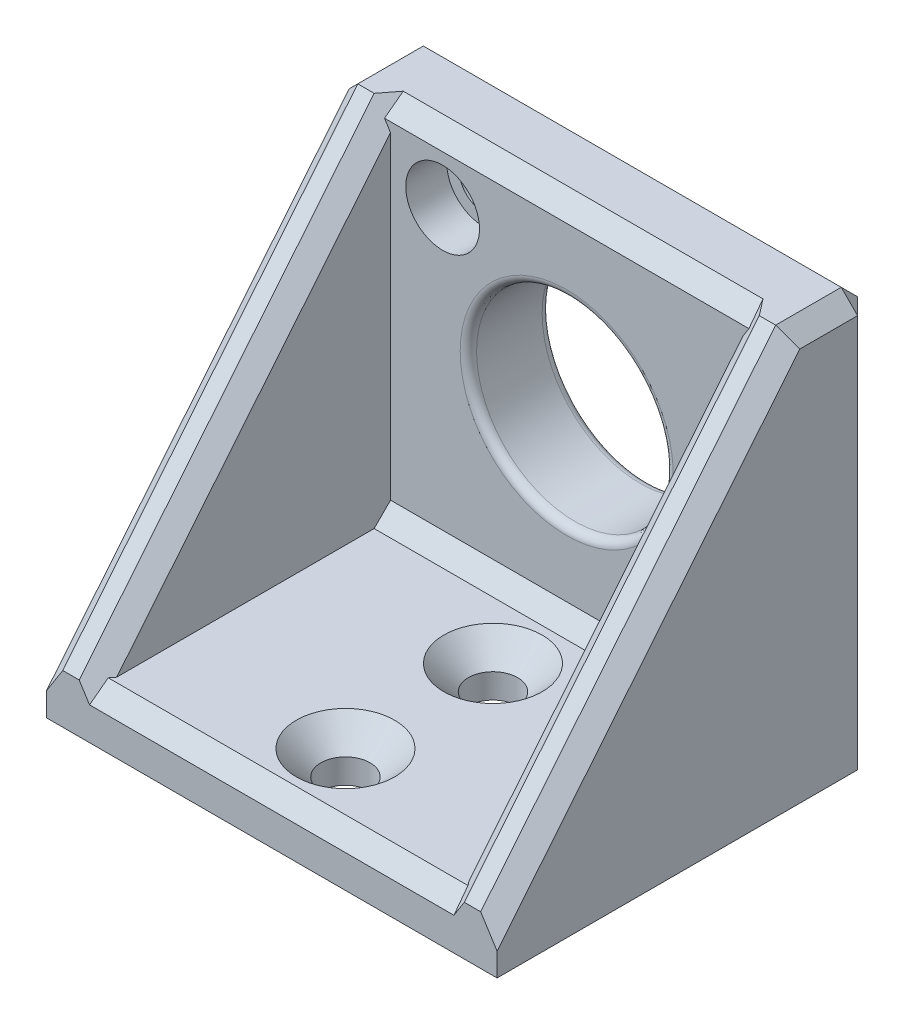
ISO-10303-21;
HEADER;
FILE_DESCRIPTION(('STEP AP214'),'2;1');
FILE_NAME('part.step','',(''),(''),'','','');
FILE_SCHEMA(('AUTOMOTIVE_DESIGN { 1 0 10303 214 1 1 1 1 }'));
ENDSEC;
DATA;
#1=APPLICATION_CONTEXT('core data for automotive mechanical design processes');
#2=APPLICATION_PROTOCOL_DEFINITION('international standard','automotive_design',2000,#1);
#3=PRODUCT_CONTEXT('',#1,'mechanical');
#4=PRODUCT('Part','Part','',(#3));
#5=PRODUCT_RELATED_PRODUCT_CATEGORY('part','',(#4));
#6=PRODUCT_DEFINITION_FORMATION('','',#4);
#7=PRODUCT_DEFINITION_CONTEXT('part definition',#1,'design');
#8=PRODUCT_DEFINITION('design','',#6,#7);
#9=PRODUCT_DEFINITION_SHAPE('','',#8);
#10=(LENGTH_UNIT() NAMED_UNIT(*) SI_UNIT(.MILLI.,.METRE.));
#11=(NAMED_UNIT(*) PLANE_ANGLE_UNIT() SI_UNIT($,.RADIAN.));
#12=(NAMED_UNIT(*) SI_UNIT($,.STERADIAN.) SOLID_ANGLE_UNIT());
#13=UNCERTAINTY_MEASURE_WITH_UNIT(LENGTH_MEASURE(1.E-05),#10,'distance_accuracy_value','');
#14=(GEOMETRIC_REPRESENTATION_CONTEXT(3) GLOBAL_UNCERTAINTY_ASSIGNED_CONTEXT((#13)) GLOBAL_UNIT_ASSIGNED_CONTEXT((#10,
#11,#12)) REPRESENTATION_CONTEXT('',''));
#15=CARTESIAN_POINT('',(0.,0.,0.));
#16=DIRECTION('',(0.,0.,1.));
#17=DIRECTION('',(1.,0.,0.));
#18=AXIS2_PLACEMENT_3D('',#15,#16,#17);
#19=CARTESIAN_POINT('',(-7.57152999600558,8.54331700444714,0.));
#20=DIRECTION('',(0.,0.,1.));
#21=DIRECTION('',(1.,0.,0.));
#22=AXIS2_PLACEMENT_3D('',#19,#20,#21);
#23=CYLINDRICAL_SURFACE('',#22,1.5);
#24=CARTESIAN_POINT('',(-7.57152999600558,8.54331700444714,0.));
#25=DIRECTION('',(0.,0.,1.));
#26=DIRECTION('',(1.,0.,0.));
#27=AXIS2_PLACEMENT_3D('',#24,#25,#26);
#28=CIRCLE('',#27,1.5);
#29=CARTESIAN_POINT('',(-6.07152999600558,8.54331700444714,0.));
#30=VERTEX_POINT('',#29);
#31=EDGE_CURVE('E277',#30,#30,#28,.T.);
#32=ORIENTED_EDGE('',*,*,#31,.F.);
#33=EDGE_LOOP('',(#32));
#34=FACE_BOUND('',#33,.T.);
#35=CARTESIAN_POINT('',(-7.57152999600558,8.54331700444714,2.5));
#36=DIRECTION('',(0.,0.,1.));
#37=DIRECTION('',(1.,0.,0.));
#38=AXIS2_PLACEMENT_3D('',#35,#36,#37);
#39=CIRCLE('',#38,1.5);
#40=CARTESIAN_POINT('',(-6.07152999600558,8.54331700444714,2.5));
#41=VERTEX_POINT('',#40);
#42=EDGE_CURVE('E49',#41,#41,#39,.F.);
#43=ORIENTED_EDGE('',*,*,#42,.F.);
#44=EDGE_LOOP('',(#43));
#45=FACE_BOUND('',#44,.T.);
#46=ADVANCED_FACE('F45',(#34,#45),#23,.F.);
#47=CARTESIAN_POINT('',(0.,0.,5.));
#48=DIRECTION('',(0.,0.,-1.));
#49=DIRECTION('',(-1.,0.,0.));
#50=AXIS2_PLACEMENT_3D('',#47,#48,#49);
#51=PLANE('',#50);
#52=CARTESIAN_POINT('',(-7.57152999600558,8.54331700444714,5.));
#53=DIRECTION('',(0.,0.,1.));
#54=DIRECTION('',(1.,0.,0.));
#55=AXIS2_PLACEMENT_3D('',#52,#53,#54);
#56=CIRCLE('',#55,2.25);
#57=CARTESIAN_POINT('',(-5.32152999600558,8.54331700444714,5.));
#58=VERTEX_POINT('',#57);
#59=EDGE_CURVE('E980',#58,#58,#56,.T.);
#60=ORIENTED_EDGE('',*,*,#59,.F.);
#61=EDGE_LOOP('',(#60));
#62=FACE_BOUND('',#61,.T.);
#63=CARTESIAN_POINT('',(0.,1.5,5.));
#64=DIRECTION('',(0.,0.,-1.));
#65=DIRECTION('',(-1.,0.,0.));
#66=AXIS2_PLACEMENT_3D('',#63,#64,#65);
#67=CIRCLE('',#66,6.5);
#68=CARTESIAN_POINT('',(-6.5,1.5,5.));
#69=VERTEX_POINT('',#68);
#70=EDGE_CURVE('E54',#69,#69,#67,.T.);
#71=ORIENTED_EDGE('',*,*,#70,.T.);
#72=EDGE_LOOP('',(#71));
#73=FACE_BOUND('',#72,.T.);
#74=DIRECTION('',(0.,-1.,0.));
#75=VECTOR('',#74,1.);
#76=CARTESIAN_POINT('',(-10.75,12.5,5.));
#77=LINE('',#76,#75);
#78=CARTESIAN_POINT('',(-10.75,10.9208143996053,5.));
#79=VERTEX_POINT('',#78);
#80=CARTESIAN_POINT('',(-10.75,-8.50000000000001,5.));
#81=VERTEX_POINT('',#80);
#82=EDGE_CURVE('E449',#79,#81,#77,.T.);
#83=ORIENTED_EDGE('',*,*,#82,.T.);
#84=DIRECTION('',(1.,0.,0.));
#85=VECTOR('',#84,1.);
#86=CARTESIAN_POINT('',(10.75,-8.50000000000001,5.));
#87=LINE('',#86,#85);
#88=CARTESIAN_POINT('',(10.75,-8.50000000000001,5.));
#89=VERTEX_POINT('',#88);
#90=EDGE_CURVE('E330',#81,#89,#87,.T.);
#91=ORIENTED_EDGE('',*,*,#90,.T.);
#92=DIRECTION('',(0.,1.,0.));
#93=VECTOR('',#92,1.);
#94=CARTESIAN_POINT('',(10.75,-9.50000000000001,5.));
#95=LINE('',#94,#93);
#96=CARTESIAN_POINT('',(10.75,10.9208143996053,5.));
#97=VERTEX_POINT('',#96);
#98=EDGE_CURVE('E461',#89,#97,#95,.T.);
#99=ORIENTED_EDGE('',*,*,#98,.T.);
#100=DIRECTION('',(-0.534994468449987,-0.844855560867013,0.));
#101=VECTOR('',#100,1.);
#102=CARTESIAN_POINT('',(2.73701264876472,-1.73317984160995,5.));
#103=LINE('',#102,#101);
#104=CARTESIAN_POINT('',(11.1167622097427,11.5,5.));
#105=VERTEX_POINT('',#104);
#106=EDGE_CURVE('E312',#97,#105,#103,.F.);
#107=ORIENTED_EDGE('',*,*,#106,.T.);
#108=DIRECTION('',(-1.,0.,0.));
#109=VECTOR('',#108,1.);
#110=CARTESIAN_POINT('',(0.,11.5,5.));
#111=LINE('',#110,#109);
#112=CARTESIAN_POINT('',(-11.1167622097428,11.5,5.));
#113=VERTEX_POINT('',#112);
#114=EDGE_CURVE('E327',#105,#113,#111,.T.);
#115=ORIENTED_EDGE('',*,*,#114,.T.);
#116=DIRECTION('',(-0.534994468449987,0.844855560867013,0.));
#117=VECTOR('',#116,1.);
#118=CARTESIAN_POINT('',(-2.73701264876472,-1.73317984160995,5.));
#119=LINE('',#118,#117);
#120=EDGE_CURVE('E315',#113,#79,#119,.F.);
#121=ORIENTED_EDGE('',*,*,#120,.T.);
#122=EDGE_LOOP('',(#83,#91,#99,#107,#115,#121));
#123=FACE_BOUND('',#122,.T.);
#124=ADVANCED_FACE('F362',(#62,#73,#123),#51,.F.);
#125=CARTESIAN_POINT('',(-13.75,12.5,5.));
#126=DIRECTION('',(1.,0.,0.));
#127=DIRECTION('',(0.,1.,0.));
#128=AXIS2_PLACEMENT_3D('',#125,#126,#127);
#129=PLANE('',#128);
#130=DIRECTION('',(0.,-1.,0.));
#131=VECTOR('',#130,1.);
#132=CARTESIAN_POINT('',(-13.75,-12.5,23.));
#133=LINE('',#132,#131);
#134=CARTESIAN_POINT('',(-13.75,-11.0791856003947,23.));
#135=VERTEX_POINT('',#134);
#136=CARTESIAN_POINT('',(-13.75,-12.5,23.));
#137=VERTEX_POINT('',#136);
#138=EDGE_CURVE('E185',#135,#137,#133,.T.);
#139=ORIENTED_EDGE('',*,*,#138,.F.);
#140=DIRECTION('',(0.,0.773957299203321,-0.633237790257263));
#141=VECTOR('',#140,1.);
#142=CARTESIAN_POINT('',(-13.75,11.8667622097427,4.22604270079668));
#143=LINE('',#142,#141);
#144=CARTESIAN_POINT('',(-13.75,11.5,4.52612087240438));
#145=VERTEX_POINT('',#144);
#146=EDGE_CURVE('E240',#135,#145,#143,.T.);
#147=ORIENTED_EDGE('',*,*,#146,.T.);
#148=DIRECTION('',(0.,0.,-1.));
#149=VECTOR('',#148,1.);
#150=CARTESIAN_POINT('',(-13.75,11.5,5.));
#151=LINE('',#150,#149);
#152=CARTESIAN_POINT('',(-13.75,11.5,0.999999999999997));
#153=VERTEX_POINT('',#152);
#154=EDGE_CURVE('E238',#145,#153,#151,.T.);
#155=ORIENTED_EDGE('',*,*,#154,.T.);
#156=DIRECTION('',(0.,-1.,0.));
#157=VECTOR('',#156,1.);
#158=CARTESIAN_POINT('',(-13.75,-12.5,0.999999999999997));
#159=LINE('',#158,#157);
#160=CARTESIAN_POINT('',(-13.75,-12.5,0.999999999999997));
#161=VERTEX_POINT('',#160);
#162=EDGE_CURVE('E204',#153,#161,#159,.T.);
#163=ORIENTED_EDGE('',*,*,#162,.T.);
#164=DIRECTION('',(0.,0.,-1.));
#165=VECTOR('',#164,1.);
#166=CARTESIAN_POINT('',(-13.75,-12.5,5.));
#167=LINE('',#166,#165);
#168=EDGE_CURVE('E201',#137,#161,#167,.T.);
#169=ORIENTED_EDGE('',*,*,#168,.F.);
#170=EDGE_LOOP('',(#139,#147,#155,#163,#169));
#171=FACE_BOUND('',#170,.T.);
#172=ADVANCED_FACE('F202',(#171),#129,.F.);
#173=CARTESIAN_POINT('',(13.75,-12.5,5.));
#174=DIRECTION('',(0.,1.,0.));
#175=DIRECTION('',(-1.,0.,0.));
#176=AXIS2_PLACEMENT_3D('',#173,#174,#175);
#177=PLANE('',#176);
#178=CARTESIAN_POINT('',(0.,-12.5,9.5));
#179=DIRECTION('',(0.,1.,0.));
#180=DIRECTION('',(-1.,0.,0.));
#181=AXIS2_PLACEMENT_3D('',#178,#179,#180);
#182=CIRCLE('',#181,1.5);
#183=CARTESIAN_POINT('',(-1.5,-12.5,9.5));
#184=VERTEX_POINT('',#183);
#185=EDGE_CURVE('E451',#184,#184,#182,.T.);
#186=ORIENTED_EDGE('',*,*,#185,.T.);
#187=EDGE_LOOP('',(#186));
#188=FACE_BOUND('',#187,.T.);
#189=CARTESIAN_POINT('',(0.,-12.5,18.5));
#190=DIRECTION('',(0.,1.,0.));
#191=DIRECTION('',(-1.,0.,0.));
#192=AXIS2_PLACEMENT_3D('',#189,#190,#191);
#193=CIRCLE('',#192,1.5);
#194=CARTESIAN_POINT('',(-1.5,-12.5,18.5));
#195=VERTEX_POINT('',#194);
#196=EDGE_CURVE('E298',#195,#195,#193,.T.);
#197=ORIENTED_EDGE('',*,*,#196,.T.);
#198=EDGE_LOOP('',(#197));
#199=FACE_BOUND('',#198,.T.);
#200=ORIENTED_EDGE('',*,*,#168,.T.);
#201=DIRECTION('',(0.70710678118655,0.,-0.707106781186545));
#202=VECTOR('',#201,1.);
#203=CARTESIAN_POINT('',(-13.75,-12.5,0.999999999999998));
#204=LINE('',#203,#202);
#205=CARTESIAN_POINT('',(-12.75,-12.5,0.));
#206=VERTEX_POINT('',#205);
#207=EDGE_CURVE('E265',#161,#206,#204,.T.);
#208=ORIENTED_EDGE('',*,*,#207,.T.);
#209=DIRECTION('',(1.,0.,0.));
#210=VECTOR('',#209,1.);
#211=CARTESIAN_POINT('',(13.75,-12.5,0.));
#212=LINE('',#211,#210);
#213=CARTESIAN_POINT('',(12.75,-12.5,0.));
#214=VERTEX_POINT('',#213);
#215=EDGE_CURVE('E219',#206,#214,#212,.T.);
#216=ORIENTED_EDGE('',*,*,#215,.T.);
#217=DIRECTION('',(0.70710678118655,0.,0.707106781186545));
#218=VECTOR('',#217,1.);
#219=CARTESIAN_POINT('',(13.75,-12.5,0.999999999999997));
#220=LINE('',#219,#218);
#221=CARTESIAN_POINT('',(13.75,-12.5,0.999999999999997));
#222=VERTEX_POINT('',#221);
#223=EDGE_CURVE('E263',#214,#222,#220,.T.);
#224=ORIENTED_EDGE('',*,*,#223,.T.);
#225=DIRECTION('',(0.,0.,-1.));
#226=VECTOR('',#225,1.);
#227=CARTESIAN_POINT('',(13.75,-12.5,5.));
#228=LINE('',#227,#226);
#229=CARTESIAN_POINT('',(13.75,-12.5,23.));
#230=VERTEX_POINT('',#229);
#231=EDGE_CURVE('E208',#230,#222,#228,.T.);
#232=ORIENTED_EDGE('',*,*,#231,.F.);
#233=DIRECTION('',(1.,0.,0.));
#234=VECTOR('',#233,1.);
#235=CARTESIAN_POINT('',(-13.75,-12.5,23.));
#236=LINE('',#235,#234);
#237=EDGE_CURVE('E191',#137,#230,#236,.T.);
#238=ORIENTED_EDGE('',*,*,#237,.F.);
#239=EDGE_LOOP('',(#200,#208,#216,#224,#232,#238));
#240=FACE_BOUND('',#239,.T.);
#241=ADVANCED_FACE('F210',(#188,#199,#240),#177,.F.);
#242=CARTESIAN_POINT('',(13.75,12.5,5.));
#243=DIRECTION('',(-1.,0.,0.));
#244=DIRECTION('',(0.,-1.,0.));
#245=AXIS2_PLACEMENT_3D('',#242,#243,#244);
#246=PLANE('',#245);
#247=DIRECTION('',(0.,0.,1.));
#248=VECTOR('',#247,1.);
#249=CARTESIAN_POINT('',(13.75,11.5,5.));
#250=LINE('',#249,#248);
#251=CARTESIAN_POINT('',(13.75,11.5,0.999999999999997));
#252=VERTEX_POINT('',#251);
#253=CARTESIAN_POINT('',(13.75,11.5,4.52612087240438));
#254=VERTEX_POINT('',#253);
#255=EDGE_CURVE('E250',#252,#254,#250,.T.);
#256=ORIENTED_EDGE('',*,*,#255,.T.);
#257=DIRECTION('',(0.,-0.773957299203321,0.633237790257263));
#258=VECTOR('',#257,1.);
#259=CARTESIAN_POINT('',(13.75,-10.1332377902573,22.2260427007967));
#260=LINE('',#259,#258);
#261=CARTESIAN_POINT('',(13.75,-11.0791856003947,23.));
#262=VERTEX_POINT('',#261);
#263=EDGE_CURVE('E252',#254,#262,#260,.T.);
#264=ORIENTED_EDGE('',*,*,#263,.T.);
#265=DIRECTION('',(0.,1.,0.));
#266=VECTOR('',#265,1.);
#267=CARTESIAN_POINT('',(13.75,-12.5,23.));
#268=LINE('',#267,#266);
#269=EDGE_CURVE('E212',#230,#262,#268,.T.);
#270=ORIENTED_EDGE('',*,*,#269,.F.);
#271=ORIENTED_EDGE('',*,*,#231,.T.);
#272=DIRECTION('',(0.,1.,0.));
#273=VECTOR('',#272,1.);
#274=CARTESIAN_POINT('',(13.75,12.5,0.999999999999997));
#275=LINE('',#274,#273);
#276=EDGE_CURVE('E248',#222,#252,#275,.T.);
#277=ORIENTED_EDGE('',*,*,#276,.T.);
#278=EDGE_LOOP('',(#256,#264,#270,#271,#277));
#279=FACE_BOUND('',#278,.T.);
#280=ADVANCED_FACE('F422',(#279),#246,.F.);
#281=CARTESIAN_POINT('',(13.75,12.5,5.));
#282=DIRECTION('',(0.,-1.,0.));
#283=DIRECTION('',(1.,0.,0.));
#284=AXIS2_PLACEMENT_3D('',#281,#282,#283);
#285=PLANE('',#284);
#286=DIRECTION('',(-1.,0.,0.));
#287=VECTOR('',#286,1.);
#288=CARTESIAN_POINT('',(-10.75,12.5,5.));
#289=LINE('',#288,#287);
#290=CARTESIAN_POINT('',(-11.75,12.5,5.));
#291=VERTEX_POINT('',#290);
#292=CARTESIAN_POINT('',(-12.75,12.5,5.));
#293=VERTEX_POINT('',#292);
#294=EDGE_CURVE('E453',#291,#293,#289,.T.);
#295=ORIENTED_EDGE('',*,*,#294,.F.);
#296=DIRECTION('',(-0.612056372482123,0.,0.790814135498364));
#297=VECTOR('',#296,1.);
#298=CARTESIAN_POINT('',(-20.4624109594529,12.5,16.2569659442725));
#299=LINE('',#298,#297);
#300=CARTESIAN_POINT('',(-10.9760427007967,12.5,4.));
#301=VERTEX_POINT('',#300);
#302=EDGE_CURVE('E69',#291,#301,#299,.F.);
#303=ORIENTED_EDGE('',*,*,#302,.T.);
#304=DIRECTION('',(1.,0.,0.));
#305=VECTOR('',#304,1.);
#306=CARTESIAN_POINT('',(13.75,12.5,4.));
#307=LINE('',#306,#305);
#308=CARTESIAN_POINT('',(10.9760427007967,12.5,4.));
#309=VERTEX_POINT('',#308);
#310=EDGE_CURVE('E336',#301,#309,#307,.T.);
#311=ORIENTED_EDGE('',*,*,#310,.T.);
#312=DIRECTION('',(-0.612056372482123,0.,-0.790814135498364));
#313=VECTOR('',#312,1.);
#314=CARTESIAN_POINT('',(11.75,12.5,5.));
#315=LINE('',#314,#313);
#316=CARTESIAN_POINT('',(11.75,12.5,5.));
#317=VERTEX_POINT('',#316);
#318=EDGE_CURVE('E334',#309,#317,#315,.F.);
#319=ORIENTED_EDGE('',*,*,#318,.T.);
#320=DIRECTION('',(-1.,0.,0.));
#321=VECTOR('',#320,1.);
#322=CARTESIAN_POINT('',(13.75,12.5,5.));
#323=LINE('',#322,#321);
#324=CARTESIAN_POINT('',(12.75,12.5,5.));
#325=VERTEX_POINT('',#324);
#326=EDGE_CURVE('E220',#325,#317,#323,.T.);
#327=ORIENTED_EDGE('',*,*,#326,.F.);
#328=DIRECTION('',(0.,0.,-1.));
#329=VECTOR('',#328,1.);
#330=CARTESIAN_POINT('',(12.75,12.5,5.));
#331=LINE('',#330,#329);
#332=CARTESIAN_POINT('',(12.75,12.5,0.999999999999997));
#333=VERTEX_POINT('',#332);
#334=EDGE_CURVE('E258',#325,#333,#331,.T.);
#335=ORIENTED_EDGE('',*,*,#334,.T.);
#336=DIRECTION('',(-1.,0.,0.));
#337=VECTOR('',#336,1.);
#338=CARTESIAN_POINT('',(-13.75,12.5,0.999999999999997));
#339=LINE('',#338,#337);
#340=CARTESIAN_POINT('',(-12.75,12.5,0.999999999999997));
#341=VERTEX_POINT('',#340);
#342=EDGE_CURVE('E256',#333,#341,#339,.T.);
#343=ORIENTED_EDGE('',*,*,#342,.T.);
#344=DIRECTION('',(0.,0.,1.));
#345=VECTOR('',#344,1.);
#346=CARTESIAN_POINT('',(-12.75,12.5,5.));
#347=LINE('',#346,#345);
#348=EDGE_CURVE('E260',#341,#293,#347,.T.);
#349=ORIENTED_EDGE('',*,*,#348,.T.);
#350=EDGE_LOOP('',(#295,#303,#311,#319,#327,#335,#343,#349));
#351=FACE_BOUND('',#350,.T.);
#352=ADVANCED_FACE('F386',(#351),#285,.F.);
#353=CARTESIAN_POINT('',(0.,0.,0.));
#354=DIRECTION('',(0.,0.,-1.));
#355=DIRECTION('',(-1.,0.,0.));
#356=AXIS2_PLACEMENT_3D('',#353,#354,#355);
#357=PLANE('',#356);
#358=CARTESIAN_POINT('',(0.,1.5,0.));
#359=DIRECTION('',(0.,0.,-1.));
#360=DIRECTION('',(-1.,0.,0.));
#361=AXIS2_PLACEMENT_3D('',#358,#359,#360);
#362=CIRCLE('',#361,6.5);
#363=CARTESIAN_POINT('',(-6.5,1.5,0.));
#364=VERTEX_POINT('',#363);
#365=EDGE_CURVE('E11',#364,#364,#362,.F.);
#366=ORIENTED_EDGE('',*,*,#365,.T.);
#367=EDGE_LOOP('',(#366));
#368=FACE_BOUND('',#367,.T.);
#369=ORIENTED_EDGE('',*,*,#31,.T.);
#370=EDGE_LOOP('',(#369));
#371=FACE_BOUND('',#370,.T.);
#372=ORIENTED_EDGE('',*,*,#215,.F.);
#373=DIRECTION('',(0.,1.,0.));
#374=VECTOR('',#373,1.);
#375=CARTESIAN_POINT('',(-12.75,12.5,0.));
#376=LINE('',#375,#374);
#377=CARTESIAN_POINT('',(-12.75,11.5,0.));
#378=VERTEX_POINT('',#377);
#379=EDGE_CURVE('E271',#206,#378,#376,.T.);
#380=ORIENTED_EDGE('',*,*,#379,.T.);
#381=DIRECTION('',(1.,0.,0.));
#382=VECTOR('',#381,1.);
#383=CARTESIAN_POINT('',(13.75,11.5,0.));
#384=LINE('',#383,#382);
#385=CARTESIAN_POINT('',(12.75,11.5,0.));
#386=VERTEX_POINT('',#385);
#387=EDGE_CURVE('E267',#378,#386,#384,.T.);
#388=ORIENTED_EDGE('',*,*,#387,.T.);
#389=DIRECTION('',(0.,-1.,0.));
#390=VECTOR('',#389,1.);
#391=CARTESIAN_POINT('',(12.75,-12.5,0.));
#392=LINE('',#391,#390);
#393=EDGE_CURVE('E269',#386,#214,#392,.T.);
#394=ORIENTED_EDGE('',*,*,#393,.T.);
#395=EDGE_LOOP('',(#372,#380,#388,#394));
#396=FACE_BOUND('',#395,.T.);
#397=ADVANCED_FACE('F382',(#368,#371,#396),#357,.T.);
#398=CARTESIAN_POINT('',(-13.75,-9.50000000000001,23.));
#399=DIRECTION('',(0.,-1.,0.));
#400=DIRECTION('',(0.,0.,-1.));
#401=AXIS2_PLACEMENT_3D('',#398,#399,#400);
#402=PLANE('',#401);
#403=CARTESIAN_POINT('',(0.,-9.50000000000001,18.5));
#404=DIRECTION('',(0.,-1.,0.));
#405=DIRECTION('',(0.,0.,-1.));
#406=AXIS2_PLACEMENT_3D('',#403,#404,#405);
#407=CIRCLE('',#406,3.);
#408=CARTESIAN_POINT('',(0.,-9.5,21.5));
#409=VERTEX_POINT('',#408);
#410=EDGE_CURVE('E231',#409,#409,#407,.T.);
#411=ORIENTED_EDGE('',*,*,#410,.T.);
#412=EDGE_LOOP('',(#411));
#413=FACE_BOUND('',#412,.T.);
#414=CARTESIAN_POINT('',(0.,-9.50000000000001,9.5));
#415=DIRECTION('',(0.,-1.,0.));
#416=DIRECTION('',(0.,0.,-1.));
#417=AXIS2_PLACEMENT_3D('',#414,#415,#416);
#418=CIRCLE('',#417,3.);
#419=CARTESIAN_POINT('',(0.,-9.50000000000001,6.5));
#420=VERTEX_POINT('',#419);
#421=EDGE_CURVE('E228',#420,#420,#418,.T.);
#422=ORIENTED_EDGE('',*,*,#421,.T.);
#423=EDGE_LOOP('',(#422));
#424=FACE_BOUND('',#423,.T.);
#425=DIRECTION('',(0.,0.,-1.));
#426=VECTOR('',#425,1.);
#427=CARTESIAN_POINT('',(10.75,-9.50000000000001,23.));
#428=LINE('',#427,#426);
#429=CARTESIAN_POINT('',(10.75,-9.50000000000001,21.7079390542225));
#430=VERTEX_POINT('',#429);
#431=CARTESIAN_POINT('',(10.75,-9.50000000000001,6.00000000000001));
#432=VERTEX_POINT('',#431);
#433=EDGE_CURVE('E198',#430,#432,#428,.T.);
#434=ORIENTED_EDGE('',*,*,#433,.T.);
#435=DIRECTION('',(-1.,0.,0.));
#436=VECTOR('',#435,1.);
#437=CARTESIAN_POINT('',(-10.75,-9.50000000000001,6.00000000000001));
#438=LINE('',#437,#436);
#439=CARTESIAN_POINT('',(-10.75,-9.50000000000001,6.00000000000001));
#440=VERTEX_POINT('',#439);
#441=EDGE_CURVE('E322',#432,#440,#438,.T.);
#442=ORIENTED_EDGE('',*,*,#441,.T.);
#443=DIRECTION('',(0.,0.,1.));
#444=VECTOR('',#443,1.);
#445=CARTESIAN_POINT('',(-10.75,-9.50000000000001,5.));
#446=LINE('',#445,#444);
#447=CARTESIAN_POINT('',(-10.75,-9.50000000000001,21.7079390542226));
#448=VERTEX_POINT('',#447);
#449=EDGE_CURVE('E448',#440,#448,#446,.T.);
#450=ORIENTED_EDGE('',*,*,#449,.T.);
#451=DIRECTION('',(0.612056372482123,0.,-0.790814135498364));
#452=VECTOR('',#451,1.);
#453=CARTESIAN_POINT('',(-12.499226006192,-9.50000000000001,23.9680456621614));
#454=LINE('',#453,#452);
#455=CARTESIAN_POINT('',(-10.9760427007967,-9.50000000000001,22.));
#456=VERTEX_POINT('',#455);
#457=EDGE_CURVE('E317',#448,#456,#454,.F.);
#458=ORIENTED_EDGE('',*,*,#457,.T.);
#459=DIRECTION('',(1.,0.,0.));
#460=VECTOR('',#459,1.);
#461=CARTESIAN_POINT('',(-13.75,-9.50000000000001,22.));
#462=LINE('',#461,#460);
#463=CARTESIAN_POINT('',(10.9760427007967,-9.50000000000001,22.));
#464=VERTEX_POINT('',#463);
#465=EDGE_CURVE('E320',#456,#464,#462,.T.);
#466=ORIENTED_EDGE('',*,*,#465,.T.);
#467=DIRECTION('',(0.612056372482123,0.,0.790814135498364));
#468=VECTOR('',#467,1.);
#469=CARTESIAN_POINT('',(2.19736842105265,-9.50000000000001,10.6574178074418));
#470=LINE('',#469,#468);
#471=EDGE_CURVE('E310',#464,#430,#470,.F.);
#472=ORIENTED_EDGE('',*,*,#471,.T.);
#473=EDGE_LOOP('',(#434,#442,#450,#458,#466,#472));
#474=FACE_BOUND('',#473,.T.);
#475=ADVANCED_FACE('F385',(#413,#424,#474),#402,.F.);
#476=CARTESIAN_POINT('',(0.,0.,23.));
#477=DIRECTION('',(0.,0.,-1.));
#478=DIRECTION('',(-1.,0.,0.));
#479=AXIS2_PLACEMENT_3D('',#476,#477,#478);
#480=PLANE('',#479);
#481=DIRECTION('',(-1.,0.,0.));
#482=VECTOR('',#481,1.);
#483=CARTESIAN_POINT('',(0.,-10.5,23.));
#484=LINE('',#483,#482);
#485=CARTESIAN_POINT('',(11.1167622097428,-10.5,23.));
#486=VERTEX_POINT('',#485);
#487=CARTESIAN_POINT('',(-11.1167622097427,-10.5,23.));
#488=VERTEX_POINT('',#487);
#489=EDGE_CURVE('E341',#486,#488,#484,.T.);
#490=ORIENTED_EDGE('',*,*,#489,.T.);
#491=DIRECTION('',(0.534994468449987,-0.844855560867013,0.));
#492=VECTOR('',#491,1.);
#493=CARTESIAN_POINT('',(-11.75,-9.50000000000001,23.));
#494=LINE('',#493,#492);
#495=CARTESIAN_POINT('',(-11.75,-9.50000000000001,23.));
#496=VERTEX_POINT('',#495);
#497=EDGE_CURVE('E343',#488,#496,#494,.F.);
#498=ORIENTED_EDGE('',*,*,#497,.T.);
#499=DIRECTION('',(-1.,0.,0.));
#500=VECTOR('',#499,1.);
#501=CARTESIAN_POINT('',(-10.75,-9.50000000000001,23.));
#502=LINE('',#501,#500);
#503=CARTESIAN_POINT('',(-12.75,-9.50000000000001,23.));
#504=VERTEX_POINT('',#503);
#505=EDGE_CURVE('E459',#496,#504,#502,.T.);
#506=ORIENTED_EDGE('',*,*,#505,.T.);
#507=DIRECTION('',(-0.53499446844999,-0.844855560867012,0.));
#508=VECTOR('',#507,1.);
#509=CARTESIAN_POINT('',(-3.37859102507674,5.29919410860795,23.));
#510=LINE('',#509,#508);
#511=EDGE_CURVE('E194',#504,#135,#510,.T.);
#512=ORIENTED_EDGE('',*,*,#511,.T.);
#513=ORIENTED_EDGE('',*,*,#138,.T.);
#514=ORIENTED_EDGE('',*,*,#237,.T.);
#515=ORIENTED_EDGE('',*,*,#269,.T.);
#516=DIRECTION('',(-0.53499446844999,0.844855560867011,0.));
#517=VECTOR('',#516,1.);
#518=CARTESIAN_POINT('',(3.37859102507673,5.29919410860795,23.));
#519=LINE('',#518,#517);
#520=CARTESIAN_POINT('',(12.75,-9.50000000000001,23.));
#521=VERTEX_POINT('',#520);
#522=EDGE_CURVE('E245',#262,#521,#519,.T.);
#523=ORIENTED_EDGE('',*,*,#522,.T.);
#524=DIRECTION('',(-1.,0.,0.));
#525=VECTOR('',#524,1.);
#526=CARTESIAN_POINT('',(-13.75,-9.50000000000001,23.));
#527=LINE('',#526,#525);
#528=CARTESIAN_POINT('',(11.75,-9.50000000000001,23.));
#529=VERTEX_POINT('',#528);
#530=EDGE_CURVE('E214',#521,#529,#527,.T.);
#531=ORIENTED_EDGE('',*,*,#530,.T.);
#532=DIRECTION('',(0.534994468449987,0.844855560867013,0.));
#533=VECTOR('',#532,1.);
#534=CARTESIAN_POINT('',(21.6938471374674,6.20318021201414,23.));
#535=LINE('',#534,#533);
#536=EDGE_CURVE('E61',#529,#486,#535,.F.);
#537=ORIENTED_EDGE('',*,*,#536,.T.);
#538=EDGE_LOOP('',(#490,#498,#506,#512,#513,#514,#515,#523,#531,#537));
#539=FACE_BOUND('',#538,.T.);
#540=ADVANCED_FACE('F188',(#539),#480,.F.);
#541=CARTESIAN_POINT('',(10.75,12.5,5.));
#542=DIRECTION('',(0.,0.633237790257262,0.773957299203321));
#543=DIRECTION('',(0.,-0.773957299203321,0.633237790257263));
#544=AXIS2_PLACEMENT_3D('',#541,#542,#543);
#545=PLANE('',#544);
#546=ORIENTED_EDGE('',*,*,#326,.T.);
#547=DIRECTION('',(0.,-0.773957299203321,0.633237790257263));
#548=VECTOR('',#547,1.);
#549=CARTESIAN_POINT('',(11.75,12.5,5.));
#550=LINE('',#549,#548);
#551=EDGE_CURVE('E273',#317,#529,#550,.T.);
#552=ORIENTED_EDGE('',*,*,#551,.T.);
#553=ORIENTED_EDGE('',*,*,#530,.F.);
#554=DIRECTION('',(0.,0.773957299203321,-0.633237790257263));
#555=VECTOR('',#554,1.);
#556=CARTESIAN_POINT('',(12.75,12.5,5.));
#557=LINE('',#556,#555);
#558=EDGE_CURVE('E254',#521,#325,#557,.T.);
#559=ORIENTED_EDGE('',*,*,#558,.T.);
#560=EDGE_LOOP('',(#546,#552,#553,#559));
#561=FACE_BOUND('',#560,.T.);
#562=ADVANCED_FACE('F429',(#561),#545,.T.);
#563=CARTESIAN_POINT('',(10.75,0.,0.));
#564=DIRECTION('',(-1.,0.,0.));
#565=DIRECTION('',(0.,-1.,0.));
#566=AXIS2_PLACEMENT_3D('',#563,#564,#565);
#567=PLANE('',#566);
#568=ORIENTED_EDGE('',*,*,#98,.F.);
#569=DIRECTION('',(0.,0.707106781186542,-0.707106781186553));
#570=VECTOR('',#569,1.);
#571=CARTESIAN_POINT('',(10.75,-1.75000000000007,-1.75000000000004));
#572=LINE('',#571,#570);
#573=EDGE_CURVE('E332',#89,#432,#572,.F.);
#574=ORIENTED_EDGE('',*,*,#573,.T.);
#575=ORIENTED_EDGE('',*,*,#433,.F.);
#576=DIRECTION('',(0.,0.773957299203321,-0.633237790257263));
#577=VECTOR('',#576,1.);
#578=CARTESIAN_POINT('',(10.75,6.82963349687144,8.34732982950954));
#579=LINE('',#578,#577);
#580=EDGE_CURVE('E301',#430,#97,#579,.T.);
#581=ORIENTED_EDGE('',*,*,#580,.T.);
#582=EDGE_LOOP('',(#568,#574,#575,#581));
#583=FACE_BOUND('',#582,.T.);
#584=ADVANCED_FACE('F474',(#583),#567,.T.);
#585=CARTESIAN_POINT('',(-10.75,-9.50000000000001,23.));
#586=DIRECTION('',(0.,0.633237790257262,0.773957299203321));
#587=DIRECTION('',(0.,-0.773957299203321,0.633237790257263));
#588=AXIS2_PLACEMENT_3D('',#585,#586,#587);
#589=PLANE('',#588);
#590=ORIENTED_EDGE('',*,*,#505,.F.);
#591=DIRECTION('',(0.,0.773957299203321,-0.633237790257263));
#592=VECTOR('',#591,1.);
#593=CARTESIAN_POINT('',(-11.75,-9.50000000000001,23.));
#594=LINE('',#593,#592);
#595=EDGE_CURVE('E304',#496,#291,#594,.T.);
#596=ORIENTED_EDGE('',*,*,#595,.T.);
#597=ORIENTED_EDGE('',*,*,#294,.T.);
#598=DIRECTION('',(0.,-0.773957299203321,0.633237790257263));
#599=VECTOR('',#598,1.);
#600=CARTESIAN_POINT('',(-12.75,-9.50000000000001,23.));
#601=LINE('',#600,#599);
#602=EDGE_CURVE('E242',#293,#504,#601,.T.);
#603=ORIENTED_EDGE('',*,*,#602,.T.);
#604=EDGE_LOOP('',(#590,#596,#597,#603));
#605=FACE_BOUND('',#604,.T.);
#606=ADVANCED_FACE('F482',(#605),#589,.T.);
#607=CARTESIAN_POINT('',(-10.75,0.,0.));
#608=DIRECTION('',(1.,0.,0.));
#609=DIRECTION('',(0.,1.,0.));
#610=AXIS2_PLACEMENT_3D('',#607,#608,#609);
#611=PLANE('',#610);
#612=ORIENTED_EDGE('',*,*,#449,.F.);
#613=DIRECTION('',(0.,-0.707106781186542,0.707106781186553));
#614=VECTOR('',#613,1.);
#615=CARTESIAN_POINT('',(-10.75,-1.75000000000007,-1.75000000000004));
#616=LINE('',#615,#614);
#617=EDGE_CURVE('E325',#440,#81,#616,.F.);
#618=ORIENTED_EDGE('',*,*,#617,.T.);
#619=ORIENTED_EDGE('',*,*,#82,.F.);
#620=DIRECTION('',(0.,-0.773957299203321,0.633237790257263));
#621=VECTOR('',#620,1.);
#622=CARTESIAN_POINT('',(-10.75,6.82963349687144,8.34732982950955));
#623=LINE('',#622,#621);
#624=EDGE_CURVE('E307',#79,#448,#623,.T.);
#625=ORIENTED_EDGE('',*,*,#624,.T.);
#626=EDGE_LOOP('',(#612,#618,#619,#625));
#627=FACE_BOUND('',#626,.T.);
#628=ADVANCED_FACE('F447',(#627),#611,.T.);
#629=CARTESIAN_POINT('',(0.,-14.5,18.5));
#630=DIRECTION('',(0.,1.,0.));
#631=DIRECTION('',(0.,0.,1.));
#632=AXIS2_PLACEMENT_3D('',#629,#630,#631);
#633=CYLINDRICAL_SURFACE('',#632,1.5);
#634=CARTESIAN_POINT('',(0.,-11.,18.5));
#635=DIRECTION('',(0.,-1.,0.));
#636=DIRECTION('',(0.,0.,-1.));
#637=AXIS2_PLACEMENT_3D('',#634,#635,#636);
#638=CIRCLE('',#637,1.5);
#639=CARTESIAN_POINT('',(0.,-11.,20.));
#640=VERTEX_POINT('',#639);
#641=EDGE_CURVE('E207',#640,#640,#638,.F.);
#642=ORIENTED_EDGE('',*,*,#641,.T.);
#643=EDGE_LOOP('',(#642));
#644=FACE_BOUND('',#643,.T.);
#645=ORIENTED_EDGE('',*,*,#196,.F.);
#646=EDGE_LOOP('',(#645));
#647=FACE_BOUND('',#646,.T.);
#648=ADVANCED_FACE('F514',(#644,#647),#633,.F.);
#649=CARTESIAN_POINT('',(0.,-14.5,9.5));
#650=DIRECTION('',(0.,1.,0.));
#651=DIRECTION('',(0.,0.,1.));
#652=AXIS2_PLACEMENT_3D('',#649,#650,#651);
#653=CYLINDRICAL_SURFACE('',#652,1.5);
#654=CARTESIAN_POINT('',(0.,-11.,9.5));
#655=DIRECTION('',(0.,-1.,0.));
#656=DIRECTION('',(0.,0.,-1.));
#657=AXIS2_PLACEMENT_3D('',#654,#655,#656);
#658=CIRCLE('',#657,1.5);
#659=CARTESIAN_POINT('',(0.,-11.,8.));
#660=VERTEX_POINT('',#659);
#661=EDGE_CURVE('E234',#660,#660,#658,.F.);
#662=ORIENTED_EDGE('',*,*,#661,.T.);
#663=EDGE_LOOP('',(#662));
#664=FACE_BOUND('',#663,.T.);
#665=ORIENTED_EDGE('',*,*,#185,.F.);
#666=EDGE_LOOP('',(#665));
#667=FACE_BOUND('',#666,.T.);
#668=ADVANCED_FACE('F510',(#664,#667),#653,.F.);
#669=CARTESIAN_POINT('',(0.,-11.,18.5));
#670=DIRECTION('',(0.,1.,0.));
#671=DIRECTION('',(0.,0.,1.));
#672=AXIS2_PLACEMENT_3D('',#669,#670,#671);
#673=CONICAL_SURFACE('',#672,1.5,0.785398163397449);
#674=CARTESIAN_POINT('',(0.,-9.5,21.5));
#675=CARTESIAN_POINT('',(0.,-9.515625,21.484375));
#676=CARTESIAN_POINT('',(0.,-9.53125,21.46875));
#677=CARTESIAN_POINT('',(0.,-9.5625,21.4375));
#678=CARTESIAN_POINT('',(0.,-9.578125,21.421875));
#679=CARTESIAN_POINT('',(0.,-9.609375,21.390625));
#680=CARTESIAN_POINT('',(0.,-9.625,21.375));
#681=CARTESIAN_POINT('',(0.,-9.65625,21.34375));
#682=CARTESIAN_POINT('',(0.,-9.671875,21.328125));
#683=CARTESIAN_POINT('',(0.,-9.703125,21.296875));
#684=CARTESIAN_POINT('',(0.,-9.71875,21.28125));
#685=CARTESIAN_POINT('',(0.,-9.75,21.25));
#686=CARTESIAN_POINT('',(0.,-9.765625,21.234375));
#687=CARTESIAN_POINT('',(0.,-9.796875,21.203125));
#688=CARTESIAN_POINT('',(0.,-9.8125,21.1875));
#689=CARTESIAN_POINT('',(0.,-9.84375,21.15625));
#690=CARTESIAN_POINT('',(0.,-9.859375,21.140625));
#691=CARTESIAN_POINT('',(0.,-9.890625,21.109375));
#692=CARTESIAN_POINT('',(0.,-9.90625,21.09375));
#693=CARTESIAN_POINT('',(0.,-9.9375,21.0625));
#694=CARTESIAN_POINT('',(0.,-9.953125,21.046875));
#695=CARTESIAN_POINT('',(0.,-9.984375,21.015625));
#696=CARTESIAN_POINT('',(0.,-10.,21.));
#697=CARTESIAN_POINT('',(0.,-10.03125,20.96875));
#698=CARTESIAN_POINT('',(0.,-10.046875,20.953125));
#699=CARTESIAN_POINT('',(0.,-10.078125,20.921875));
#700=CARTESIAN_POINT('',(0.,-10.09375,20.90625));
#701=CARTESIAN_POINT('',(0.,-10.125,20.875));
#702=CARTESIAN_POINT('',(0.,-10.140625,20.859375));
#703=CARTESIAN_POINT('',(0.,-10.171875,20.828125));
#704=CARTESIAN_POINT('',(0.,-10.1875,20.8125));
#705=CARTESIAN_POINT('',(0.,-10.21875,20.78125));
#706=CARTESIAN_POINT('',(0.,-10.234375,20.765625));
#707=CARTESIAN_POINT('',(0.,-10.265625,20.734375));
#708=CARTESIAN_POINT('',(0.,-10.28125,20.71875));
#709=CARTESIAN_POINT('',(0.,-10.3125,20.6875));
#710=CARTESIAN_POINT('',(0.,-10.328125,20.671875));
#711=CARTESIAN_POINT('',(0.,-10.359375,20.640625));
#712=CARTESIAN_POINT('',(0.,-10.375,20.625));
#713=CARTESIAN_POINT('',(0.,-10.40625,20.59375));
#714=CARTESIAN_POINT('',(0.,-10.421875,20.578125));
#715=CARTESIAN_POINT('',(0.,-10.453125,20.546875));
#716=CARTESIAN_POINT('',(0.,-10.46875,20.53125));
#717=CARTESIAN_POINT('',(0.,-10.5,20.5));
#718=CARTESIAN_POINT('',(0.,-10.515625,20.484375));
#719=CARTESIAN_POINT('',(0.,-10.546875,20.453125));
#720=CARTESIAN_POINT('',(0.,-10.5625,20.4375));
#721=CARTESIAN_POINT('',(0.,-10.59375,20.40625));
#722=CARTESIAN_POINT('',(0.,-10.609375,20.390625));
#723=CARTESIAN_POINT('',(0.,-10.640625,20.359375));
#724=CARTESIAN_POINT('',(0.,-10.65625,20.34375));
#725=CARTESIAN_POINT('',(0.,-10.6875,20.3125));
#726=CARTESIAN_POINT('',(0.,-10.703125,20.296875));
#727=CARTESIAN_POINT('',(0.,-10.734375,20.265625));
#728=CARTESIAN_POINT('',(0.,-10.75,20.25));
#729=CARTESIAN_POINT('',(0.,-10.78125,20.21875));
#730=CARTESIAN_POINT('',(0.,-10.796875,20.203125));
#731=CARTESIAN_POINT('',(0.,-10.828125,20.171875));
#732=CARTESIAN_POINT('',(0.,-10.84375,20.15625));
#733=CARTESIAN_POINT('',(0.,-10.875,20.125));
#734=CARTESIAN_POINT('',(0.,-10.890625,20.109375));
#735=CARTESIAN_POINT('',(0.,-10.921875,20.078125));
#736=CARTESIAN_POINT('',(0.,-10.9375,20.0625));
#737=CARTESIAN_POINT('',(0.,-10.96875,20.03125));
#738=CARTESIAN_POINT('',(0.,-10.984375,20.015625));
#739=CARTESIAN_POINT('',(0.,-11.,20.));
#740=B_SPLINE_CURVE_WITH_KNOTS('',3,(#674,#675,#676,#677,#678,#679,#680,#681,#682,#683,#684,
#685,#686,#687,#688,#689,#690,#691,#692,#693,#694,#695,#696,#697,#698,#699,#700,#701,#702,#703,
#704,#705,#706,#707,#708,#709,#710,#711,#712,#713,#714,#715,#716,#717,#718,#719,#720,#721,#722,
#723,#724,#725,#726,#727,#728,#729,#730,#731,#732,#733,#734,#735,#736,#737,#738,#739),
.UNSPECIFIED.,.F.,.F.,(4,2,2,2,2,2,2,2,2,2,2,2,2,2,2,2,2,2,2,2,2,2,2,2,2,2,2,2,2,2,2,2,4),(0.,
0.0662912607362401,0.132582521472478,0.198873782208718,0.265165042944956,0.331456303681193,
0.397747564417433,0.464038825153673,0.530330085889911,0.596621346626149,0.662912607362388,
0.729203868098628,0.795495128834865,0.861786389571103,0.928077650307343,0.994368911043583,
1.06066017177982,1.12695143251606,1.1932426932523,1.25953395398854,1.32582521472478,
1.39211647546101,1.45840773619725,1.52469899693349,1.59099025766973,1.65728151840597,
1.72357277914221,1.78986403987845,1.85615530061469,1.92244656135092,1.98873782208716,
2.0550290828234,2.12132034355964),.UNSPECIFIED.);
#741=EDGE_CURVE('BSEAM513',#409,#640,#740,.T.);
#742=ORIENTED_EDGE('',*,*,#410,.F.);
#743=ORIENTED_EDGE('',*,*,#641,.F.);
#744=ORIENTED_EDGE('',*,*,#741,.T.);
#745=ORIENTED_EDGE('',*,*,#741,.F.);
#746=EDGE_LOOP('',(#742,#744,#743,#745));
#747=FACE_BOUND('',#746,.T.);
#748=ADVANCED_FACE('F513',(#747),#673,.F.);
#749=CARTESIAN_POINT('',(0.,-11.,9.5));
#750=DIRECTION('',(0.,1.,0.));
#751=DIRECTION('',(0.,0.,1.));
#752=AXIS2_PLACEMENT_3D('',#749,#750,#751);
#753=CONICAL_SURFACE('',#752,1.5,0.78539816339745);
#754=ORIENTED_EDGE('',*,*,#421,.F.);
#755=EDGE_LOOP('',(#754));
#756=FACE_BOUND('',#755,.T.);
#757=ORIENTED_EDGE('',*,*,#661,.F.);
#758=EDGE_LOOP('',(#757));
#759=FACE_BOUND('',#758,.T.);
#760=ADVANCED_FACE('F547',(#756,#759),#753,.F.);
#761=CARTESIAN_POINT('',(13.75,11.8667622097427,4.22604270079668));
#762=DIRECTION('',(0.707106781186545,0.447766735594497,0.547270454615496));
#763=DIRECTION('',(0.,0.773957299203321,-0.633237790257263));
#764=AXIS2_PLACEMENT_3D('',#761,#762,#763);
#765=PLANE('',#764);
#766=ORIENTED_EDGE('',*,*,#522,.F.);
#767=ORIENTED_EDGE('',*,*,#263,.F.);
#768=DIRECTION('',(-0.670467604748961,0.670467604748966,0.317720603619558));
#769=VECTOR('',#768,1.);
#770=CARTESIAN_POINT('',(12.75,12.5,4.99999999999999));
#771=LINE('',#770,#769);
#772=EDGE_CURVE('E295',#325,#254,#771,.F.);
#773=ORIENTED_EDGE('',*,*,#772,.F.);
#774=ORIENTED_EDGE('',*,*,#558,.F.);
#775=EDGE_LOOP('',(#766,#767,#773,#774));
#776=FACE_BOUND('',#775,.T.);
#777=ADVANCED_FACE('F425',(#776),#765,.T.);
#778=CARTESIAN_POINT('',(13.75,12.5,0.999999999999997));
#779=DIRECTION('',(0.707106781186545,0.,-0.70710678118655));
#780=DIRECTION('',(0.,-1.,0.));
#781=AXIS2_PLACEMENT_3D('',#778,#779,#780);
#782=PLANE('',#781);
#783=ORIENTED_EDGE('',*,*,#223,.F.);
#784=ORIENTED_EDGE('',*,*,#393,.F.);
#785=DIRECTION('',(-0.70710678118655,0.,-0.707106781186545));
#786=VECTOR('',#785,1.);
#787=CARTESIAN_POINT('',(13.25,11.5,0.499999999999999));
#788=LINE('',#787,#786);
#789=EDGE_CURVE('E292',#252,#386,#788,.T.);
#790=ORIENTED_EDGE('',*,*,#789,.F.);
#791=ORIENTED_EDGE('',*,*,#276,.F.);
#792=EDGE_LOOP('',(#783,#784,#790,#791));
#793=FACE_BOUND('',#792,.T.);
#794=ADVANCED_FACE('F410',(#793),#782,.T.);
#795=CARTESIAN_POINT('',(12.75,12.5,5.));
#796=DIRECTION('',(-0.70710678118655,-0.707106781186545,0.));
#797=DIRECTION('',(0.,0.,-1.));
#798=AXIS2_PLACEMENT_3D('',#795,#796,#797);
#799=PLANE('',#798);
#800=ORIENTED_EDGE('',*,*,#772,.T.);
#801=ORIENTED_EDGE('',*,*,#255,.F.);
#802=DIRECTION('',(-0.707106781186545,0.70710678118655,0.));
#803=VECTOR('',#802,1.);
#804=CARTESIAN_POINT('',(12.75,12.5,0.999999999999997));
#805=LINE('',#804,#803);
#806=EDGE_CURVE('E289',#333,#252,#805,.F.);
#807=ORIENTED_EDGE('',*,*,#806,.F.);
#808=ORIENTED_EDGE('',*,*,#334,.F.);
#809=EDGE_LOOP('',(#800,#801,#807,#808));
#810=FACE_BOUND('',#809,.T.);
#811=ADVANCED_FACE('F418',(#810),#799,.F.);
#812=CARTESIAN_POINT('',(12.75,12.5,0.999999999999997));
#813=DIRECTION('',(0.577350269189626,0.577350269189622,-0.57735026918963));
#814=DIRECTION('',(-0.70710678118655,0.,-0.707106781186545));
#815=AXIS2_PLACEMENT_3D('',#812,#813,#814);
#816=PLANE('',#815);
#817=ORIENTED_EDGE('',*,*,#806,.T.);
#818=ORIENTED_EDGE('',*,*,#789,.T.);
#819=DIRECTION('',(0.,0.70710678118655,0.707106781186545));
#820=VECTOR('',#819,1.);
#821=CARTESIAN_POINT('',(12.75,12.5,0.999999999999997));
#822=LINE('',#821,#820);
#823=EDGE_CURVE('E286',#333,#386,#822,.F.);
#824=ORIENTED_EDGE('',*,*,#823,.F.);
#825=EDGE_LOOP('',(#817,#818,#824));
#826=FACE_BOUND('',#825,.T.);
#827=ADVANCED_FACE('F413',(#826),#816,.T.);
#828=CARTESIAN_POINT('',(-13.75,12.5,0.999999999999997));
#829=DIRECTION('',(-0.707106781186545,0.,-0.70710678118655));
#830=DIRECTION('',(0.,1.,0.));
#831=AXIS2_PLACEMENT_3D('',#828,#829,#830);
#832=PLANE('',#831);
#833=ORIENTED_EDGE('',*,*,#207,.F.);
#834=ORIENTED_EDGE('',*,*,#162,.F.);
#835=DIRECTION('',(-0.70710678118655,0.,0.707106781186545));
#836=VECTOR('',#835,1.);
#837=CARTESIAN_POINT('',(-13.75,11.5,0.999999999999997));
#838=LINE('',#837,#836);
#839=EDGE_CURVE('E283',#378,#153,#838,.T.);
#840=ORIENTED_EDGE('',*,*,#839,.F.);
#841=ORIENTED_EDGE('',*,*,#379,.F.);
#842=EDGE_LOOP('',(#833,#834,#840,#841));
#843=FACE_BOUND('',#842,.T.);
#844=ADVANCED_FACE('F398',(#843),#832,.T.);
#845=CARTESIAN_POINT('',(13.75,12.5,0.999999999999997));
#846=DIRECTION('',(0.,0.707106781186545,-0.70710678118655));
#847=DIRECTION('',(1.,0.,0.));
#848=AXIS2_PLACEMENT_3D('',#845,#846,#847);
#849=PLANE('',#848);
#850=ORIENTED_EDGE('',*,*,#823,.T.);
#851=ORIENTED_EDGE('',*,*,#387,.F.);
#852=DIRECTION('',(0.,-0.70710678118655,-0.707106781186545));
#853=VECTOR('',#852,1.);
#854=CARTESIAN_POINT('',(-12.75,12.,0.499999999999999));
#855=LINE('',#854,#853);
#856=EDGE_CURVE('E280',#341,#378,#855,.T.);
#857=ORIENTED_EDGE('',*,*,#856,.F.);
#858=ORIENTED_EDGE('',*,*,#342,.F.);
#859=EDGE_LOOP('',(#850,#851,#857,#858));
#860=FACE_BOUND('',#859,.T.);
#861=ADVANCED_FACE('F406',(#860),#849,.T.);
#862=CARTESIAN_POINT('',(-13.75,11.5,0.999999999999997));
#863=DIRECTION('',(-0.577350269189626,0.577350269189622,-0.57735026918963));
#864=DIRECTION('',(-0.70710678118655,0.,0.707106781186545));
#865=AXIS2_PLACEMENT_3D('',#862,#863,#864);
#866=PLANE('',#865);
#867=ORIENTED_EDGE('',*,*,#856,.T.);
#868=ORIENTED_EDGE('',*,*,#839,.T.);
#869=DIRECTION('',(-0.707106781186545,-0.70710678118655,0.));
#870=VECTOR('',#869,1.);
#871=CARTESIAN_POINT('',(-13.75,11.5,0.999999999999997));
#872=LINE('',#871,#870);
#873=EDGE_CURVE('E276',#341,#153,#872,.T.);
#874=ORIENTED_EDGE('',*,*,#873,.F.);
#875=EDGE_LOOP('',(#867,#868,#874));
#876=FACE_BOUND('',#875,.T.);
#877=ADVANCED_FACE('F402',(#876),#866,.T.);
#878=CARTESIAN_POINT('',(-13.75,11.5,5.));
#879=DIRECTION('',(0.70710678118655,-0.707106781186545,0.));
#880=DIRECTION('',(0.,0.,-1.));
#881=AXIS2_PLACEMENT_3D('',#878,#879,#880);
#882=PLANE('',#881);
#883=ORIENTED_EDGE('',*,*,#873,.T.);
#884=ORIENTED_EDGE('',*,*,#154,.F.);
#885=DIRECTION('',(-0.670467604748961,-0.670467604748965,-0.317720603619558));
#886=VECTOR('',#885,1.);
#887=CARTESIAN_POINT('',(-13.6490536180356,11.6009463819644,4.57395725582359));
#888=LINE('',#887,#886);
#889=EDGE_CURVE('E274',#293,#145,#888,.T.);
#890=ORIENTED_EDGE('',*,*,#889,.F.);
#891=ORIENTED_EDGE('',*,*,#348,.F.);
#892=EDGE_LOOP('',(#883,#884,#890,#891));
#893=FACE_BOUND('',#892,.T.);
#894=ADVANCED_FACE('F489',(#893),#882,.F.);
#895=CARTESIAN_POINT('',(-13.75,11.8667622097427,4.22604270079668));
#896=DIRECTION('',(-0.707106781186545,0.447766735594496,0.547270454615496));
#897=DIRECTION('',(0.,-0.773957299203321,0.633237790257263));
#898=AXIS2_PLACEMENT_3D('',#895,#896,#897);
#899=PLANE('',#898);
#900=ORIENTED_EDGE('',*,*,#511,.F.);
#901=ORIENTED_EDGE('',*,*,#602,.F.);
#902=ORIENTED_EDGE('',*,*,#889,.T.);
#903=ORIENTED_EDGE('',*,*,#146,.F.);
#904=EDGE_LOOP('',(#900,#901,#902,#903));
#905=FACE_BOUND('',#904,.T.);
#906=ADVANCED_FACE('F486',(#905),#899,.T.);
#907=CARTESIAN_POINT('',(11.75,12.5,5.));
#908=DIRECTION('',(0.707106781186548,-0.447766735594495,-0.547270454615494));
#909=DIRECTION('',(0.,-0.773957299203321,0.633237790257263));
#910=AXIS2_PLACEMENT_3D('',#907,#908,#909);
#911=PLANE('',#910);
#912=ORIENTED_EDGE('',*,*,#106,.F.);
#913=ORIENTED_EDGE('',*,*,#580,.F.);
#914=ORIENTED_EDGE('',*,*,#471,.F.);
#915=DIRECTION('',(0.0990147542976711,-0.703632033960708,0.703632033960712));
#916=VECTOR('',#915,1.);
#917=CARTESIAN_POINT('',(11.0077743449413,-9.72549569979539,22.2254956997954));
#918=LINE('',#917,#916);
#919=EDGE_CURVE('E351',#464,#486,#918,.T.);
#920=ORIENTED_EDGE('',*,*,#919,.T.);
#921=ORIENTED_EDGE('',*,*,#536,.F.);
#922=ORIENTED_EDGE('',*,*,#551,.F.);
#923=ORIENTED_EDGE('',*,*,#318,.F.);
#924=DIRECTION('',(0.0990147542976711,-0.703632033960708,0.703632033960712));
#925=VECTOR('',#924,1.);
#926=CARTESIAN_POINT('',(11.0077743449413,12.2745043002046,4.22549569979539));
#927=LINE('',#926,#925);
#928=EDGE_CURVE('E347',#309,#105,#927,.T.);
#929=ORIENTED_EDGE('',*,*,#928,.T.);
#930=EDGE_LOOP('',(#912,#913,#914,#920,#921,#922,#923,#929));
#931=FACE_BOUND('',#930,.T.);
#932=ADVANCED_FACE('F432',(#931),#911,.F.);
#933=CARTESIAN_POINT('',(-11.75,-9.50000000000001,23.));
#934=DIRECTION('',(-0.707106781186548,-0.447766735594495,-0.547270454615494));
#935=DIRECTION('',(0.,0.773957299203321,-0.633237790257263));
#936=AXIS2_PLACEMENT_3D('',#933,#934,#935);
#937=PLANE('',#936);
#938=ORIENTED_EDGE('',*,*,#457,.F.);
#939=ORIENTED_EDGE('',*,*,#624,.F.);
#940=ORIENTED_EDGE('',*,*,#120,.F.);
#941=DIRECTION('',(0.0990147542976708,0.703632033960708,-0.703632033960712));
#942=VECTOR('',#941,1.);
#943=CARTESIAN_POINT('',(-11.0077743449413,12.2745043002046,4.22549569979539));
#944=LINE('',#943,#942);
#945=EDGE_CURVE('E345',#113,#301,#944,.T.);
#946=ORIENTED_EDGE('',*,*,#945,.T.);
#947=ORIENTED_EDGE('',*,*,#302,.F.);
#948=ORIENTED_EDGE('',*,*,#595,.F.);
#949=ORIENTED_EDGE('',*,*,#497,.F.);
#950=DIRECTION('',(0.0990147542976708,0.703632033960708,-0.703632033960712));
#951=VECTOR('',#950,1.);
#952=CARTESIAN_POINT('',(-11.0077743449413,-9.7254956997954,22.2254956997954));
#953=LINE('',#952,#951);
#954=EDGE_CURVE('E349',#488,#456,#953,.T.);
#955=ORIENTED_EDGE('',*,*,#954,.T.);
#956=EDGE_LOOP('',(#938,#939,#940,#946,#947,#948,#949,#955));
#957=FACE_BOUND('',#956,.T.);
#958=ADVANCED_FACE('F444',(#957),#937,.F.);
#959=CARTESIAN_POINT('',(-13.75,-9.50000000000001,6.00000000000001));
#960=DIRECTION('',(0.,0.707106781186553,0.707106781186542));
#961=DIRECTION('',(1.,0.,0.));
#962=AXIS2_PLACEMENT_3D('',#959,#960,#961);
#963=PLANE('',#962);
#964=ORIENTED_EDGE('',*,*,#573,.F.);
#965=ORIENTED_EDGE('',*,*,#90,.F.);
#966=ORIENTED_EDGE('',*,*,#617,.F.);
#967=ORIENTED_EDGE('',*,*,#441,.F.);
#968=EDGE_LOOP('',(#964,#965,#966,#967));
#969=FACE_BOUND('',#968,.T.);
#970=ADVANCED_FACE('F472',(#969),#963,.T.);
#971=CARTESIAN_POINT('',(0.,11.5,5.));
#972=DIRECTION('',(0.,-0.70710678118655,-0.707106781186545));
#973=DIRECTION('',(-1.,0.,0.));
#974=AXIS2_PLACEMENT_3D('',#971,#972,#973);
#975=PLANE('',#974);
#976=ORIENTED_EDGE('',*,*,#928,.F.);
#977=ORIENTED_EDGE('',*,*,#310,.F.);
#978=ORIENTED_EDGE('',*,*,#945,.F.);
#979=ORIENTED_EDGE('',*,*,#114,.F.);
#980=EDGE_LOOP('',(#976,#977,#978,#979));
#981=FACE_BOUND('',#980,.T.);
#982=ADVANCED_FACE('F438',(#981),#975,.F.);
#983=CARTESIAN_POINT('',(0.,-10.5,23.));
#984=DIRECTION('',(0.,-0.70710678118655,-0.707106781186545));
#985=DIRECTION('',(-1.,0.,0.));
#986=AXIS2_PLACEMENT_3D('',#983,#984,#985);
#987=PLANE('',#986);
#988=ORIENTED_EDGE('',*,*,#919,.F.);
#989=ORIENTED_EDGE('',*,*,#465,.F.);
#990=ORIENTED_EDGE('',*,*,#954,.F.);
#991=ORIENTED_EDGE('',*,*,#489,.F.);
#992=EDGE_LOOP('',(#988,#989,#990,#991));
#993=FACE_BOUND('',#992,.T.);
#994=ADVANCED_FACE('F373',(#993),#987,.F.);
#995=CARTESIAN_POINT('',(0.,1.5,0.));
#996=DIRECTION('',(0.,0.,1.));
#997=DIRECTION('',(1.,0.,0.));
#998=AXIS2_PLACEMENT_3D('',#995,#996,#997);
#999=CYLINDRICAL_SURFACE('',#998,6.);
#1000=CARTESIAN_POINT('',(0.,1.5,4.5));
#1001=DIRECTION('',(0.,0.,-1.));
#1002=DIRECTION('',(-1.,0.,0.));
#1003=AXIS2_PLACEMENT_3D('',#1000,#1001,#1002);
#1004=CIRCLE('',#1003,6.);
#1005=CARTESIAN_POINT('',(-6.,1.5,4.5));
#1006=VERTEX_POINT('',#1005);
#1007=EDGE_CURVE('E356',#1006,#1006,#1004,.F.);
#1008=ORIENTED_EDGE('',*,*,#1007,.T.);
#1009=EDGE_LOOP('',(#1008));
#1010=FACE_BOUND('',#1009,.T.);
#1011=CARTESIAN_POINT('',(0.,1.5,0.5));
#1012=DIRECTION('',(0.,0.,-1.));
#1013=DIRECTION('',(-1.,0.,0.));
#1014=AXIS2_PLACEMENT_3D('',#1011,#1012,#1013);
#1015=CIRCLE('',#1014,6.);
#1016=CARTESIAN_POINT('',(-6.,1.5,0.5));
#1017=VERTEX_POINT('',#1016);
#1018=EDGE_CURVE('E353',#1017,#1017,#1015,.T.);
#1019=ORIENTED_EDGE('',*,*,#1018,.T.);
#1020=EDGE_LOOP('',(#1019));
#1021=FACE_BOUND('',#1020,.T.);
#1022=ADVANCED_FACE('F368',(#1010,#1021),#999,.F.);
#1023=CARTESIAN_POINT('',(0.,1.5,4.5));
#1024=DIRECTION('',(0.,0.,-1.));
#1025=DIRECTION('',(-1.,0.,0.));
#1026=AXIS2_PLACEMENT_3D('',#1023,#1024,#1025);
#1027=TOROIDAL_SURFACE('',#1026,6.5,0.5);
#1028=ORIENTED_EDGE('',*,*,#70,.F.);
#1029=EDGE_LOOP('',(#1028));
#1030=FACE_BOUND('',#1029,.T.);
#1031=ORIENTED_EDGE('',*,*,#1007,.F.);
#1032=EDGE_LOOP('',(#1031));
#1033=FACE_BOUND('',#1032,.T.);
#1034=ADVANCED_FACE('F365',(#1030,#1033),#1027,.T.);
#1035=CARTESIAN_POINT('',(0.,1.5,0.5));
#1036=DIRECTION('',(0.,0.,-1.));
#1037=DIRECTION('',(-1.,0.,0.));
#1038=AXIS2_PLACEMENT_3D('',#1035,#1036,#1037);
#1039=TOROIDAL_SURFACE('',#1038,6.5,0.5);
#1040=ORIENTED_EDGE('',*,*,#1018,.F.);
#1041=EDGE_LOOP('',(#1040));
#1042=FACE_BOUND('',#1041,.T.);
#1043=ORIENTED_EDGE('',*,*,#365,.F.);
#1044=EDGE_LOOP('',(#1043));
#1045=FACE_BOUND('',#1044,.T.);
#1046=ADVANCED_FACE('F47',(#1042,#1045),#1039,.T.);
#1047=CARTESIAN_POINT('',(-7.57152999600558,8.54331700444714,2.5));
#1048=DIRECTION('',(0.,0.,1.));
#1049=DIRECTION('',(1.,0.,0.));
#1050=AXIS2_PLACEMENT_3D('',#1047,#1048,#1049);
#1051=PLANE('',#1050);
#1052=CARTESIAN_POINT('',(-7.57152999600558,8.54331700444714,2.5));
#1053=DIRECTION('',(0.,0.,1.));
#1054=DIRECTION('',(1.,0.,0.));
#1055=AXIS2_PLACEMENT_3D('',#1052,#1053,#1054);
#1056=CIRCLE('',#1055,2.25);
#1057=CARTESIAN_POINT('',(-5.32152999600558,8.54331700444714,2.5));
#1058=VERTEX_POINT('',#1057);
#1059=EDGE_CURVE('E977',#1058,#1058,#1056,.T.);
#1060=ORIENTED_EDGE('',*,*,#1059,.T.);
#1061=EDGE_LOOP('',(#1060));
#1062=FACE_BOUND('',#1061,.T.);
#1063=ORIENTED_EDGE('',*,*,#42,.T.);
#1064=EDGE_LOOP('',(#1063));
#1065=FACE_BOUND('',#1064,.T.);
#1066=ADVANCED_FACE('F379',(#1062,#1065),#1051,.T.);
#1067=CARTESIAN_POINT('',(-7.57152999600558,8.54331700444714,2.5));
#1068=DIRECTION('',(0.,0.,1.));
#1069=DIRECTION('',(1.,0.,0.));
#1070=AXIS2_PLACEMENT_3D('',#1067,#1068,#1069);
#1071=CYLINDRICAL_SURFACE('',#1070,2.25);
#1072=ORIENTED_EDGE('',*,*,#1059,.F.);
#1073=EDGE_LOOP('',(#1072));
#1074=FACE_BOUND('',#1073,.T.);
#1075=ORIENTED_EDGE('',*,*,#59,.T.);
#1076=EDGE_LOOP('',(#1075));
#1077=FACE_BOUND('',#1076,.T.);
#1078=ADVANCED_FACE('F952',(#1074,#1077),#1071,.F.);
#1079=CLOSED_SHELL('',(#46,#124,#172,#241,#280,#352,#397,#475,#540,#562,#584,#606,#628,#648,
#668,#748,#760,#777,#794,#811,#827,#844,#861,#877,#894,#906,#932,#958,#970,#982,#994,#1022,
#1034,#1046,#1066,#1078));
#1080=MANIFOLD_SOLID_BREP('B2',#1079);
#1081=ADVANCED_BREP_SHAPE_REPRESENTATION('',(#18,#1080),#14);
#1082=SHAPE_DEFINITION_REPRESENTATION(#9,#1081);
ENDSEC;
END-ISO-10303-21;
